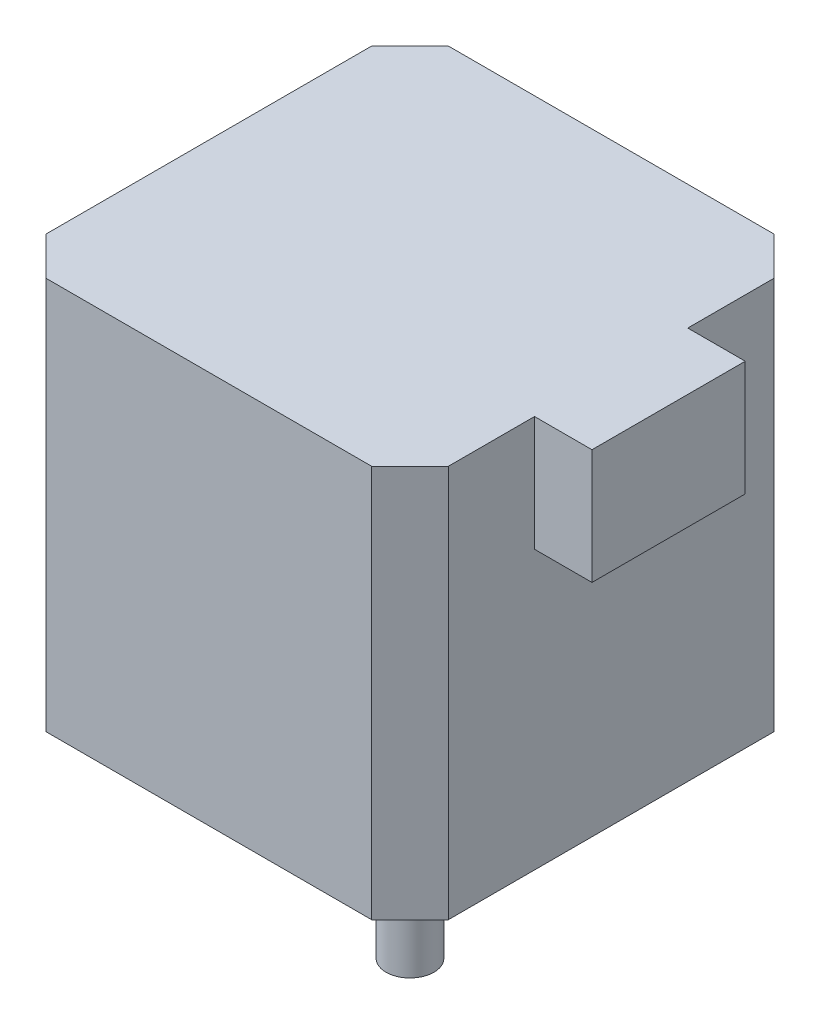
ISO-10303-21;
HEADER;
FILE_DESCRIPTION(('STEP AP214'),'2;1');
FILE_NAME('part.step','',(''),(''),'','','');
FILE_SCHEMA(('AUTOMOTIVE_DESIGN { 1 0 10303 214 1 1 1 1 }'));
ENDSEC;
DATA;
#1=APPLICATION_CONTEXT('core data for automotive mechanical design processes');
#2=APPLICATION_PROTOCOL_DEFINITION('international standard','automotive_design',2000,#1);
#3=PRODUCT_CONTEXT('',#1,'mechanical');
#4=PRODUCT('Part','Part','',(#3));
#5=PRODUCT_RELATED_PRODUCT_CATEGORY('part','',(#4));
#6=PRODUCT_DEFINITION_FORMATION('','',#4);
#7=PRODUCT_DEFINITION_CONTEXT('part definition',#1,'design');
#8=PRODUCT_DEFINITION('design','',#6,#7);
#9=PRODUCT_DEFINITION_SHAPE('','',#8);
#10=(LENGTH_UNIT() NAMED_UNIT(*) SI_UNIT(.MILLI.,.METRE.));
#11=(NAMED_UNIT(*) PLANE_ANGLE_UNIT() SI_UNIT($,.RADIAN.));
#12=(NAMED_UNIT(*) SI_UNIT($,.STERADIAN.) SOLID_ANGLE_UNIT());
#13=UNCERTAINTY_MEASURE_WITH_UNIT(LENGTH_MEASURE(1.E-05),#10,'distance_accuracy_value','');
#14=(GEOMETRIC_REPRESENTATION_CONTEXT(3) GLOBAL_UNCERTAINTY_ASSIGNED_CONTEXT((#13)) GLOBAL_UNIT_ASSIGNED_CONTEXT((#10,
#11,#12)) REPRESENTATION_CONTEXT('',''));
#15=CARTESIAN_POINT('',(0.,0.,0.));
#16=DIRECTION('',(0.,0.,1.));
#17=DIRECTION('',(1.,0.,0.));
#18=AXIS2_PLACEMENT_3D('',#15,#16,#17);
#19=CARTESIAN_POINT('',(21.,41.,-21.));
#20=DIRECTION('',(-1.,0.,0.));
#21=DIRECTION('',(0.,0.,1.));
#22=AXIS2_PLACEMENT_3D('',#19,#20,#21);
#23=PLANE('',#22);
#24=DIRECTION('',(0.,1.,0.));
#25=VECTOR('',#24,1.);
#26=CARTESIAN_POINT('',(21.,29.,-8.));
#27=LINE('',#26,#25);
#28=CARTESIAN_POINT('',(21.,29.,-8.));
#29=VERTEX_POINT('',#28);
#30=CARTESIAN_POINT('',(21.,41.,-8.00000000000001));
#31=VERTEX_POINT('',#30);
#32=EDGE_CURVE('E37',#29,#31,#27,.T.);
#33=ORIENTED_EDGE('',*,*,#32,.F.);
#34=DIRECTION('',(0.,0.,-1.));
#35=VECTOR('',#34,1.);
#36=CARTESIAN_POINT('',(21.,29.,8.));
#37=LINE('',#36,#35);
#38=CARTESIAN_POINT('',(21.,29.,8.));
#39=VERTEX_POINT('',#38);
#40=EDGE_CURVE('E169',#39,#29,#37,.T.);
#41=ORIENTED_EDGE('',*,*,#40,.F.);
#42=DIRECTION('',(0.,-1.,0.));
#43=VECTOR('',#42,1.);
#44=CARTESIAN_POINT('',(21.,29.,8.));
#45=LINE('',#44,#43);
#46=CARTESIAN_POINT('',(21.,41.,7.99999999999999));
#47=VERTEX_POINT('',#46);
#48=EDGE_CURVE('E178',#47,#39,#45,.T.);
#49=ORIENTED_EDGE('',*,*,#48,.F.);
#50=DIRECTION('',(0.,0.,-1.));
#51=VECTOR('',#50,1.);
#52=CARTESIAN_POINT('',(21.,41.,-21.));
#53=LINE('',#52,#51);
#54=CARTESIAN_POINT('',(21.,41.,17.));
#55=VERTEX_POINT('',#54);
#56=EDGE_CURVE('E205',#55,#47,#53,.T.);
#57=ORIENTED_EDGE('',*,*,#56,.F.);
#58=DIRECTION('',(0.,-1.,0.));
#59=VECTOR('',#58,1.);
#60=CARTESIAN_POINT('',(21.,41.,17.));
#61=LINE('',#60,#59);
#62=CARTESIAN_POINT('',(21.,0.,17.));
#63=VERTEX_POINT('',#62);
#64=EDGE_CURVE('E43',#55,#63,#61,.T.);
#65=ORIENTED_EDGE('',*,*,#64,.T.);
#66=DIRECTION('',(0.,0.,-1.));
#67=VECTOR('',#66,1.);
#68=CARTESIAN_POINT('',(21.,0.,-21.));
#69=LINE('',#68,#67);
#70=CARTESIAN_POINT('',(21.,0.,-17.));
#71=VERTEX_POINT('',#70);
#72=EDGE_CURVE('E193',#63,#71,#69,.T.);
#73=ORIENTED_EDGE('',*,*,#72,.T.);
#74=DIRECTION('',(0.,1.,0.));
#75=VECTOR('',#74,1.);
#76=CARTESIAN_POINT('',(21.,41.,-17.));
#77=LINE('',#76,#75);
#78=CARTESIAN_POINT('',(21.,41.,-17.));
#79=VERTEX_POINT('',#78);
#80=EDGE_CURVE('E11',#71,#79,#77,.T.);
#81=ORIENTED_EDGE('',*,*,#80,.T.);
#82=EDGE_CURVE('E54',#31,#79,#53,.T.);
#83=ORIENTED_EDGE('',*,*,#82,.F.);
#84=EDGE_LOOP('',(#33,#41,#49,#57,#65,#73,#81,#83));
#85=FACE_BOUND('',#84,.T.);
#86=ADVANCED_FACE('F33',(#85),#23,.F.);
#87=CARTESIAN_POINT('',(-21.,41.,-21.));
#88=DIRECTION('',(0.,0.,1.));
#89=DIRECTION('',(1.,0.,0.));
#90=AXIS2_PLACEMENT_3D('',#87,#88,#89);
#91=PLANE('',#90);
#92=DIRECTION('',(-1.,0.,0.));
#93=VECTOR('',#92,1.);
#94=CARTESIAN_POINT('',(-21.,0.,-21.));
#95=LINE('',#94,#93);
#96=CARTESIAN_POINT('',(17.,0.,-21.));
#97=VERTEX_POINT('',#96);
#98=CARTESIAN_POINT('',(-17.,0.,-21.));
#99=VERTEX_POINT('',#98);
#100=EDGE_CURVE('E250',#97,#99,#95,.T.);
#101=ORIENTED_EDGE('',*,*,#100,.T.);
#102=DIRECTION('',(0.,1.,0.));
#103=VECTOR('',#102,1.);
#104=CARTESIAN_POINT('',(-17.,41.,-21.));
#105=LINE('',#104,#103);
#106=CARTESIAN_POINT('',(-17.,41.,-21.));
#107=VERTEX_POINT('',#106);
#108=EDGE_CURVE('E212',#99,#107,#105,.T.);
#109=ORIENTED_EDGE('',*,*,#108,.T.);
#110=DIRECTION('',(-1.,0.,0.));
#111=VECTOR('',#110,1.);
#112=CARTESIAN_POINT('',(-21.,41.,-21.));
#113=LINE('',#112,#111);
#114=CARTESIAN_POINT('',(17.,41.,-21.));
#115=VERTEX_POINT('',#114);
#116=EDGE_CURVE('E199',#115,#107,#113,.T.);
#117=ORIENTED_EDGE('',*,*,#116,.F.);
#118=DIRECTION('',(0.,-1.,0.));
#119=VECTOR('',#118,1.);
#120=CARTESIAN_POINT('',(17.,41.,-21.));
#121=LINE('',#120,#119);
#122=EDGE_CURVE('E214',#115,#97,#121,.T.);
#123=ORIENTED_EDGE('',*,*,#122,.T.);
#124=EDGE_LOOP('',(#101,#109,#117,#123));
#125=FACE_BOUND('',#124,.T.);
#126=ADVANCED_FACE('F295',(#125),#91,.F.);
#127=CARTESIAN_POINT('',(-21.,41.,-21.));
#128=DIRECTION('',(1.,0.,0.));
#129=DIRECTION('',(0.,0.,-1.));
#130=AXIS2_PLACEMENT_3D('',#127,#128,#129);
#131=PLANE('',#130);
#132=DIRECTION('',(0.,0.,1.));
#133=VECTOR('',#132,1.);
#134=CARTESIAN_POINT('',(-21.,0.,-21.));
#135=LINE('',#134,#133);
#136=CARTESIAN_POINT('',(-21.,0.,-17.));
#137=VERTEX_POINT('',#136);
#138=CARTESIAN_POINT('',(-21.,0.,17.));
#139=VERTEX_POINT('',#138);
#140=EDGE_CURVE('E247',#137,#139,#135,.T.);
#141=ORIENTED_EDGE('',*,*,#140,.T.);
#142=DIRECTION('',(0.,1.,0.));
#143=VECTOR('',#142,1.);
#144=CARTESIAN_POINT('',(-21.,41.,17.));
#145=LINE('',#144,#143);
#146=CARTESIAN_POINT('',(-21.,41.,17.));
#147=VERTEX_POINT('',#146);
#148=EDGE_CURVE('E225',#139,#147,#145,.T.);
#149=ORIENTED_EDGE('',*,*,#148,.T.);
#150=DIRECTION('',(0.,0.,1.));
#151=VECTOR('',#150,1.);
#152=CARTESIAN_POINT('',(-21.,41.,-21.));
#153=LINE('',#152,#151);
#154=CARTESIAN_POINT('',(-21.,41.,-17.));
#155=VERTEX_POINT('',#154);
#156=EDGE_CURVE('E256',#155,#147,#153,.T.);
#157=ORIENTED_EDGE('',*,*,#156,.F.);
#158=DIRECTION('',(0.,-1.,0.));
#159=VECTOR('',#158,1.);
#160=CARTESIAN_POINT('',(-21.,41.,-17.));
#161=LINE('',#160,#159);
#162=EDGE_CURVE('E227',#155,#137,#161,.T.);
#163=ORIENTED_EDGE('',*,*,#162,.T.);
#164=EDGE_LOOP('',(#141,#149,#157,#163));
#165=FACE_BOUND('',#164,.T.);
#166=ADVANCED_FACE('F274',(#165),#131,.F.);
#167=CARTESIAN_POINT('',(-21.,41.,21.));
#168=DIRECTION('',(0.,0.,-1.));
#169=DIRECTION('',(-1.,0.,0.));
#170=AXIS2_PLACEMENT_3D('',#167,#168,#169);
#171=PLANE('',#170);
#172=DIRECTION('',(1.,0.,0.));
#173=VECTOR('',#172,1.);
#174=CARTESIAN_POINT('',(-21.,41.,21.));
#175=LINE('',#174,#173);
#176=CARTESIAN_POINT('',(-17.,41.,21.));
#177=VERTEX_POINT('',#176);
#178=CARTESIAN_POINT('',(17.,41.,21.));
#179=VERTEX_POINT('',#178);
#180=EDGE_CURVE('E243',#177,#179,#175,.T.);
#181=ORIENTED_EDGE('',*,*,#180,.F.);
#182=DIRECTION('',(0.,-1.,0.));
#183=VECTOR('',#182,1.);
#184=CARTESIAN_POINT('',(-17.,41.,21.));
#185=LINE('',#184,#183);
#186=CARTESIAN_POINT('',(-17.,0.,21.));
#187=VERTEX_POINT('',#186);
#188=EDGE_CURVE('E238',#177,#187,#185,.T.);
#189=ORIENTED_EDGE('',*,*,#188,.T.);
#190=DIRECTION('',(1.,0.,0.));
#191=VECTOR('',#190,1.);
#192=CARTESIAN_POINT('',(-21.,0.,21.));
#193=LINE('',#192,#191);
#194=CARTESIAN_POINT('',(17.,0.,21.));
#195=VERTEX_POINT('',#194);
#196=EDGE_CURVE('E244',#187,#195,#193,.T.);
#197=ORIENTED_EDGE('',*,*,#196,.T.);
#198=DIRECTION('',(0.,1.,0.));
#199=VECTOR('',#198,1.);
#200=CARTESIAN_POINT('',(17.,41.,21.));
#201=LINE('',#200,#199);
#202=EDGE_CURVE('E241',#195,#179,#201,.T.);
#203=ORIENTED_EDGE('',*,*,#202,.T.);
#204=EDGE_LOOP('',(#181,#189,#197,#203));
#205=FACE_BOUND('',#204,.T.);
#206=ADVANCED_FACE('F285',(#205),#171,.F.);
#207=CARTESIAN_POINT('',(0.,41.,0.));
#208=DIRECTION('',(0.,1.,0.));
#209=DIRECTION('',(0.,0.,1.));
#210=AXIS2_PLACEMENT_3D('',#207,#208,#209);
#211=PLANE('',#210);
#212=ORIENTED_EDGE('',*,*,#156,.T.);
#213=DIRECTION('',(-0.707106781186547,0.,-0.707106781186548));
#214=VECTOR('',#213,1.);
#215=CARTESIAN_POINT('',(-19.,41.,19.));
#216=LINE('',#215,#214);
#217=EDGE_CURVE('E217',#147,#177,#216,.F.);
#218=ORIENTED_EDGE('',*,*,#217,.T.);
#219=ORIENTED_EDGE('',*,*,#180,.T.);
#220=DIRECTION('',(-0.707106781186548,0.,0.707106781186547));
#221=VECTOR('',#220,1.);
#222=CARTESIAN_POINT('',(19.,41.,19.));
#223=LINE('',#222,#221);
#224=EDGE_CURVE('E223',#179,#55,#223,.F.);
#225=ORIENTED_EDGE('',*,*,#224,.T.);
#226=ORIENTED_EDGE('',*,*,#56,.T.);
#227=DIRECTION('',(-1.,0.,0.));
#228=VECTOR('',#227,1.);
#229=CARTESIAN_POINT('',(27.,41.,8.));
#230=LINE('',#229,#228);
#231=CARTESIAN_POINT('',(27.,41.,8.));
#232=VERTEX_POINT('',#231);
#233=EDGE_CURVE('E184',#232,#47,#230,.T.);
#234=ORIENTED_EDGE('',*,*,#233,.F.);
#235=DIRECTION('',(0.,0.,1.));
#236=VECTOR('',#235,1.);
#237=CARTESIAN_POINT('',(27.,41.,8.));
#238=LINE('',#237,#236);
#239=CARTESIAN_POINT('',(27.,41.,-8.));
#240=VERTEX_POINT('',#239);
#241=EDGE_CURVE('E168',#240,#232,#238,.T.);
#242=ORIENTED_EDGE('',*,*,#241,.F.);
#243=DIRECTION('',(-1.,0.,0.));
#244=VECTOR('',#243,1.);
#245=CARTESIAN_POINT('',(27.,41.,-8.));
#246=LINE('',#245,#244);
#247=EDGE_CURVE('E189',#240,#31,#246,.T.);
#248=ORIENTED_EDGE('',*,*,#247,.T.);
#249=ORIENTED_EDGE('',*,*,#82,.T.);
#250=DIRECTION('',(0.707106781186546,0.,0.707106781186549));
#251=VECTOR('',#250,1.);
#252=CARTESIAN_POINT('',(19.,41.,-19.));
#253=LINE('',#252,#251);
#254=EDGE_CURVE('E221',#79,#115,#253,.F.);
#255=ORIENTED_EDGE('',*,*,#254,.T.);
#256=ORIENTED_EDGE('',*,*,#116,.T.);
#257=DIRECTION('',(0.707106781186548,0.,-0.707106781186547));
#258=VECTOR('',#257,1.);
#259=CARTESIAN_POINT('',(-19.,41.,-19.));
#260=LINE('',#259,#258);
#261=EDGE_CURVE('E219',#107,#155,#260,.F.);
#262=ORIENTED_EDGE('',*,*,#261,.T.);
#263=EDGE_LOOP('',(#212,#218,#219,#225,#226,#234,#242,#248,#249,#255,#256,#262));
#264=FACE_BOUND('',#263,.T.);
#265=ADVANCED_FACE('F264',(#264),#211,.T.);
#266=CARTESIAN_POINT('',(0.,0.,0.));
#267=DIRECTION('',(0.,1.,0.));
#268=DIRECTION('',(0.,0.,1.));
#269=AXIS2_PLACEMENT_3D('',#266,#267,#268);
#270=PLANE('',#269);
#271=CARTESIAN_POINT('',(15.5,0.,15.5));
#272=DIRECTION('',(0.,-1.,0.));
#273=DIRECTION('',(0.,0.,-1.));
#274=AXIS2_PLACEMENT_3D('',#271,#272,#273);
#275=CIRCLE('',#274,1.24999999999999);
#276=CARTESIAN_POINT('',(15.5,0.,14.25));
#277=VERTEX_POINT('',#276);
#278=EDGE_CURVE('E143',#277,#277,#275,.T.);
#279=ORIENTED_EDGE('',*,*,#278,.F.);
#280=EDGE_LOOP('',(#279));
#281=FACE_BOUND('',#280,.T.);
#282=CARTESIAN_POINT('',(-15.5,0.,15.5));
#283=DIRECTION('',(0.,-1.,0.));
#284=DIRECTION('',(0.,0.,-1.));
#285=AXIS2_PLACEMENT_3D('',#282,#283,#284);
#286=CIRCLE('',#285,1.24999999999999);
#287=CARTESIAN_POINT('',(-15.5,0.,14.25));
#288=VERTEX_POINT('',#287);
#289=EDGE_CURVE('E142',#288,#288,#286,.T.);
#290=ORIENTED_EDGE('',*,*,#289,.F.);
#291=EDGE_LOOP('',(#290));
#292=FACE_BOUND('',#291,.T.);
#293=CARTESIAN_POINT('',(-15.5,0.,-15.5));
#294=DIRECTION('',(0.,-1.,0.));
#295=DIRECTION('',(0.,0.,-1.));
#296=AXIS2_PLACEMENT_3D('',#293,#294,#295);
#297=CIRCLE('',#296,1.24999999999999);
#298=CARTESIAN_POINT('',(-15.5,0.,-16.75));
#299=VERTEX_POINT('',#298);
#300=EDGE_CURVE('E153',#299,#299,#297,.T.);
#301=ORIENTED_EDGE('',*,*,#300,.F.);
#302=EDGE_LOOP('',(#301));
#303=FACE_BOUND('',#302,.T.);
#304=CARTESIAN_POINT('',(15.5,0.,-15.5));
#305=DIRECTION('',(0.,-1.,0.));
#306=DIRECTION('',(0.,0.,-1.));
#307=AXIS2_PLACEMENT_3D('',#304,#305,#306);
#308=CIRCLE('',#307,1.24999999999999);
#309=CARTESIAN_POINT('',(15.5,0.,-16.75));
#310=VERTEX_POINT('',#309);
#311=EDGE_CURVE('E159',#310,#310,#308,.T.);
#312=ORIENTED_EDGE('',*,*,#311,.F.);
#313=EDGE_LOOP('',(#312));
#314=FACE_BOUND('',#313,.T.);
#315=CARTESIAN_POINT('',(0.,0.,0.));
#316=DIRECTION('',(0.,1.,0.));
#317=DIRECTION('',(0.,0.,1.));
#318=AXIS2_PLACEMENT_3D('',#315,#316,#317);
#319=CIRCLE('',#318,11.);
#320=CARTESIAN_POINT('',(0.,0.,11.));
#321=VERTEX_POINT('',#320);
#322=EDGE_CURVE('E194',#321,#321,#319,.T.);
#323=ORIENTED_EDGE('',*,*,#322,.T.);
#324=EDGE_LOOP('',(#323));
#325=FACE_BOUND('',#324,.T.);
#326=ORIENTED_EDGE('',*,*,#196,.F.);
#327=DIRECTION('',(0.707106781186547,0.,0.707106781186548));
#328=VECTOR('',#327,1.);
#329=CARTESIAN_POINT('',(-17.,0.,21.));
#330=LINE('',#329,#328);
#331=EDGE_CURVE('E230',#187,#139,#330,.F.);
#332=ORIENTED_EDGE('',*,*,#331,.T.);
#333=ORIENTED_EDGE('',*,*,#140,.F.);
#334=DIRECTION('',(-0.707106781186548,0.,0.707106781186547));
#335=VECTOR('',#334,1.);
#336=CARTESIAN_POINT('',(-21.,0.,-17.));
#337=LINE('',#336,#335);
#338=EDGE_CURVE('E232',#137,#99,#337,.F.);
#339=ORIENTED_EDGE('',*,*,#338,.T.);
#340=ORIENTED_EDGE('',*,*,#100,.F.);
#341=DIRECTION('',(-0.707106781186546,0.,-0.707106781186549));
#342=VECTOR('',#341,1.);
#343=CARTESIAN_POINT('',(17.,0.,-21.));
#344=LINE('',#343,#342);
#345=EDGE_CURVE('E234',#97,#71,#344,.F.);
#346=ORIENTED_EDGE('',*,*,#345,.T.);
#347=ORIENTED_EDGE('',*,*,#72,.F.);
#348=DIRECTION('',(0.707106781186548,0.,-0.707106781186547));
#349=VECTOR('',#348,1.);
#350=CARTESIAN_POINT('',(21.,0.,17.));
#351=LINE('',#350,#349);
#352=EDGE_CURVE('E236',#63,#195,#351,.F.);
#353=ORIENTED_EDGE('',*,*,#352,.T.);
#354=EDGE_LOOP('',(#326,#332,#333,#339,#340,#346,#347,#353));
#355=FACE_BOUND('',#354,.T.);
#356=ADVANCED_FACE('F278',(#281,#292,#303,#314,#325,#355),#270,.F.);
#357=CARTESIAN_POINT('',(-17.,41.,21.));
#358=DIRECTION('',(0.707106781186548,0.,-0.707106781186547));
#359=DIRECTION('',(0.,-1.,0.));
#360=AXIS2_PLACEMENT_3D('',#357,#358,#359);
#361=PLANE('',#360);
#362=ORIENTED_EDGE('',*,*,#217,.F.);
#363=ORIENTED_EDGE('',*,*,#148,.F.);
#364=ORIENTED_EDGE('',*,*,#331,.F.);
#365=ORIENTED_EDGE('',*,*,#188,.F.);
#366=EDGE_LOOP('',(#362,#363,#364,#365));
#367=FACE_BOUND('',#366,.T.);
#368=ADVANCED_FACE('F282',(#367),#361,.F.);
#369=CARTESIAN_POINT('',(-21.,41.,-17.));
#370=DIRECTION('',(0.707106781186547,0.,0.707106781186548));
#371=DIRECTION('',(0.,-1.,0.));
#372=AXIS2_PLACEMENT_3D('',#369,#370,#371);
#373=PLANE('',#372);
#374=ORIENTED_EDGE('',*,*,#261,.F.);
#375=ORIENTED_EDGE('',*,*,#108,.F.);
#376=ORIENTED_EDGE('',*,*,#338,.F.);
#377=ORIENTED_EDGE('',*,*,#162,.F.);
#378=EDGE_LOOP('',(#374,#375,#376,#377));
#379=FACE_BOUND('',#378,.T.);
#380=ADVANCED_FACE('F271',(#379),#373,.F.);
#381=CARTESIAN_POINT('',(17.,41.,-21.));
#382=DIRECTION('',(-0.707106781186549,0.,0.707106781186546));
#383=DIRECTION('',(0.,-1.,0.));
#384=AXIS2_PLACEMENT_3D('',#381,#382,#383);
#385=PLANE('',#384);
#386=ORIENTED_EDGE('',*,*,#254,.F.);
#387=ORIENTED_EDGE('',*,*,#80,.F.);
#388=ORIENTED_EDGE('',*,*,#345,.F.);
#389=ORIENTED_EDGE('',*,*,#122,.F.);
#390=EDGE_LOOP('',(#386,#387,#388,#389));
#391=FACE_BOUND('',#390,.T.);
#392=ADVANCED_FACE('F294',(#391),#385,.F.);
#393=CARTESIAN_POINT('',(21.,41.,17.));
#394=DIRECTION('',(-0.707106781186547,0.,-0.707106781186548));
#395=DIRECTION('',(0.,-1.,0.));
#396=AXIS2_PLACEMENT_3D('',#393,#394,#395);
#397=PLANE('',#396);
#398=ORIENTED_EDGE('',*,*,#224,.F.);
#399=ORIENTED_EDGE('',*,*,#202,.F.);
#400=ORIENTED_EDGE('',*,*,#352,.F.);
#401=ORIENTED_EDGE('',*,*,#64,.F.);
#402=EDGE_LOOP('',(#398,#399,#400,#401));
#403=FACE_BOUND('',#402,.T.);
#404=ADVANCED_FACE('F35',(#403),#397,.F.);
#405=CARTESIAN_POINT('',(0.,-1.7,0.));
#406=DIRECTION('',(0.,1.,0.));
#407=DIRECTION('',(0.,0.,1.));
#408=AXIS2_PLACEMENT_3D('',#405,#406,#407);
#409=CYLINDRICAL_SURFACE('',#408,11.);
#410=CARTESIAN_POINT('',(0.,-1.7,0.));
#411=DIRECTION('',(0.,1.,0.));
#412=DIRECTION('',(0.,0.,1.));
#413=AXIS2_PLACEMENT_3D('',#410,#411,#412);
#414=CIRCLE('',#413,11.);
#415=CARTESIAN_POINT('',(0.,-1.7,11.));
#416=VERTEX_POINT('',#415);
#417=EDGE_CURVE('E190',#416,#416,#414,.T.);
#418=ORIENTED_EDGE('',*,*,#417,.T.);
#419=EDGE_LOOP('',(#418));
#420=FACE_BOUND('',#419,.T.);
#421=ORIENTED_EDGE('',*,*,#322,.F.);
#422=EDGE_LOOP('',(#421));
#423=FACE_BOUND('',#422,.T.);
#424=ADVANCED_FACE('F313',(#420,#423),#409,.T.);
#425=CARTESIAN_POINT('',(0.,-1.7,0.));
#426=DIRECTION('',(0.,1.,0.));
#427=DIRECTION('',(0.,0.,1.));
#428=AXIS2_PLACEMENT_3D('',#425,#426,#427);
#429=PLANE('',#428);
#430=CARTESIAN_POINT('',(0.,-1.7,0.));
#431=DIRECTION('',(0.,1.,0.));
#432=DIRECTION('',(0.,0.,1.));
#433=AXIS2_PLACEMENT_3D('',#430,#431,#432);
#434=CIRCLE('',#433,2.5);
#435=CARTESIAN_POINT('',(0.,-1.7,2.5));
#436=VERTEX_POINT('',#435);
#437=EDGE_CURVE('E188',#436,#436,#434,.T.);
#438=ORIENTED_EDGE('',*,*,#437,.T.);
#439=EDGE_LOOP('',(#438));
#440=FACE_BOUND('',#439,.T.);
#441=ORIENTED_EDGE('',*,*,#417,.F.);
#442=EDGE_LOOP('',(#441));
#443=FACE_BOUND('',#442,.T.);
#444=ADVANCED_FACE('F317',(#440,#443),#429,.F.);
#445=CARTESIAN_POINT('',(0.,-22.5,0.));
#446=DIRECTION('',(0.,1.,0.));
#447=DIRECTION('',(0.,0.,1.));
#448=AXIS2_PLACEMENT_3D('',#445,#446,#447);
#449=CYLINDRICAL_SURFACE('',#448,2.5);
#450=CARTESIAN_POINT('',(0.,-22.5,0.));
#451=DIRECTION('',(0.,1.,0.));
#452=DIRECTION('',(0.,0.,1.));
#453=AXIS2_PLACEMENT_3D('',#450,#451,#452);
#454=CIRCLE('',#453,2.5);
#455=CARTESIAN_POINT('',(0.,-22.5,2.5));
#456=VERTEX_POINT('',#455);
#457=EDGE_CURVE('E185',#456,#456,#454,.T.);
#458=CARTESIAN_POINT('',(0.,-22.5,2.5));
#459=CARTESIAN_POINT('',(0.,-22.2833333333333,2.5));
#460=CARTESIAN_POINT('',(0.,-22.0666666666667,2.5));
#461=CARTESIAN_POINT('',(0.,-21.6333333333333,2.5));
#462=CARTESIAN_POINT('',(0.,-21.4166666666667,2.5));
#463=CARTESIAN_POINT('',(0.,-20.9833333333333,2.5));
#464=CARTESIAN_POINT('',(0.,-20.7666666666667,2.5));
#465=CARTESIAN_POINT('',(0.,-20.3333333333333,2.5));
#466=CARTESIAN_POINT('',(0.,-20.1166666666667,2.5));
#467=CARTESIAN_POINT('',(0.,-19.6833333333333,2.5));
#468=CARTESIAN_POINT('',(0.,-19.4666666666667,2.5));
#469=CARTESIAN_POINT('',(0.,-19.0333333333333,2.5));
#470=CARTESIAN_POINT('',(0.,-18.8166666666667,2.5));
#471=CARTESIAN_POINT('',(0.,-18.3833333333333,2.5));
#472=CARTESIAN_POINT('',(0.,-18.1666666666667,2.5));
#473=CARTESIAN_POINT('',(0.,-17.7333333333333,2.5));
#474=CARTESIAN_POINT('',(0.,-17.5166666666667,2.5));
#475=CARTESIAN_POINT('',(0.,-17.0833333333333,2.5));
#476=CARTESIAN_POINT('',(0.,-16.8666666666667,2.5));
#477=CARTESIAN_POINT('',(0.,-16.4333333333333,2.5));
#478=CARTESIAN_POINT('',(0.,-16.2166666666667,2.5));
#479=CARTESIAN_POINT('',(0.,-15.7833333333333,2.5));
#480=CARTESIAN_POINT('',(0.,-15.5666666666667,2.5));
#481=CARTESIAN_POINT('',(0.,-15.1333333333333,2.5));
#482=CARTESIAN_POINT('',(0.,-14.9166666666667,2.5));
#483=CARTESIAN_POINT('',(0.,-14.4833333333333,2.5));
#484=CARTESIAN_POINT('',(0.,-14.2666666666667,2.5));
#485=CARTESIAN_POINT('',(0.,-13.8333333333333,2.5));
#486=CARTESIAN_POINT('',(0.,-13.6166666666667,2.5));
#487=CARTESIAN_POINT('',(0.,-13.1833333333333,2.5));
#488=CARTESIAN_POINT('',(0.,-12.9666666666667,2.5));
#489=CARTESIAN_POINT('',(0.,-12.5333333333333,2.5));
#490=CARTESIAN_POINT('',(0.,-12.3166666666667,2.5));
#491=CARTESIAN_POINT('',(0.,-11.8833333333333,2.5));
#492=CARTESIAN_POINT('',(0.,-11.6666666666667,2.5));
#493=CARTESIAN_POINT('',(0.,-11.2333333333333,2.5));
#494=CARTESIAN_POINT('',(0.,-11.0166666666667,2.5));
#495=CARTESIAN_POINT('',(0.,-10.5833333333333,2.5));
#496=CARTESIAN_POINT('',(0.,-10.3666666666667,2.5));
#497=CARTESIAN_POINT('',(0.,-9.93333333333334,2.5));
#498=CARTESIAN_POINT('',(0.,-9.71666666666667,2.5));
#499=CARTESIAN_POINT('',(0.,-9.28333333333334,2.5));
#500=CARTESIAN_POINT('',(0.,-9.06666666666667,2.5));
#501=CARTESIAN_POINT('',(0.,-8.63333333333334,2.5));
#502=CARTESIAN_POINT('',(0.,-8.41666666666667,2.5));
#503=CARTESIAN_POINT('',(0.,-7.98333333333334,2.5));
#504=CARTESIAN_POINT('',(0.,-7.76666666666667,2.5));
#505=CARTESIAN_POINT('',(0.,-7.33333333333334,2.5));
#506=CARTESIAN_POINT('',(0.,-7.11666666666667,2.5));
#507=CARTESIAN_POINT('',(0.,-6.68333333333334,2.5));
#508=CARTESIAN_POINT('',(0.,-6.46666666666667,2.5));
#509=CARTESIAN_POINT('',(0.,-6.03333333333334,2.5));
#510=CARTESIAN_POINT('',(0.,-5.81666666666667,2.5));
#511=CARTESIAN_POINT('',(0.,-5.38333333333334,2.5));
#512=CARTESIAN_POINT('',(0.,-5.16666666666667,2.5));
#513=CARTESIAN_POINT('',(0.,-4.73333333333334,2.5));
#514=CARTESIAN_POINT('',(0.,-4.51666666666667,2.5));
#515=CARTESIAN_POINT('',(0.,-4.08333333333334,2.5));
#516=CARTESIAN_POINT('',(0.,-3.86666666666667,2.5));
#517=CARTESIAN_POINT('',(0.,-3.43333333333334,2.5));
#518=CARTESIAN_POINT('',(0.,-3.21666666666667,2.5));
#519=CARTESIAN_POINT('',(0.,-2.78333333333334,2.5));
#520=CARTESIAN_POINT('',(0.,-2.56666666666667,2.5));
#521=CARTESIAN_POINT('',(0.,-2.13333333333334,2.5));
#522=CARTESIAN_POINT('',(0.,-1.91666666666667,2.5));
#523=CARTESIAN_POINT('',(0.,-1.7,2.5));
#524=B_SPLINE_CURVE_WITH_KNOTS('',3,(#458,#459,#460,#461,#462,#463,#464,#465,#466,#467,#468,
#469,#470,#471,#472,#473,#474,#475,#476,#477,#478,#479,#480,#481,#482,#483,#484,#485,#486,#487,
#488,#489,#490,#491,#492,#493,#494,#495,#496,#497,#498,#499,#500,#501,#502,#503,#504,#505,#506,
#507,#508,#509,#510,#511,#512,#513,#514,#515,#516,#517,#518,#519,#520,#521,#522,#523),
.UNSPECIFIED.,.F.,.F.,(4,2,2,2,2,2,2,2,2,2,2,2,2,2,2,2,2,2,2,2,2,2,2,2,2,2,2,2,2,2,2,2,4),(0.,
0.649999999999998,1.3,1.95,2.6,3.25,3.9,4.55,5.2,5.85,6.5,7.15,7.8,8.45,9.1,9.75,10.4,11.05,
11.7,12.35,13.,13.65,14.3,14.95,15.6,16.25,16.9,17.55,18.2,18.85,19.5,20.15,20.8),.UNSPECIFIED.);
#525=EDGE_CURVE('BSEAM323',#456,#436,#524,.T.);
#526=ORIENTED_EDGE('',*,*,#457,.T.);
#527=ORIENTED_EDGE('',*,*,#437,.F.);
#528=ORIENTED_EDGE('',*,*,#525,.T.);
#529=ORIENTED_EDGE('',*,*,#525,.F.);
#530=EDGE_LOOP('',(#526,#528,#527,#529));
#531=FACE_BOUND('',#530,.T.);
#532=ADVANCED_FACE('F323',(#531),#449,.T.);
#533=CARTESIAN_POINT('',(0.,-22.5,0.));
#534=DIRECTION('',(0.,1.,0.));
#535=DIRECTION('',(0.,0.,1.));
#536=AXIS2_PLACEMENT_3D('',#533,#534,#535);
#537=PLANE('',#536);
#538=ORIENTED_EDGE('',*,*,#457,.F.);
#539=EDGE_LOOP('',(#538));
#540=FACE_BOUND('',#539,.T.);
#541=ADVANCED_FACE('F388',(#540),#537,.F.);
#542=CARTESIAN_POINT('',(27.,29.,-8.));
#543=DIRECTION('',(0.,0.,1.));
#544=DIRECTION('',(1.,0.,0.));
#545=AXIS2_PLACEMENT_3D('',#542,#543,#544);
#546=PLANE('',#545);
#547=ORIENTED_EDGE('',*,*,#32,.T.);
#548=ORIENTED_EDGE('',*,*,#247,.F.);
#549=DIRECTION('',(0.,1.,0.));
#550=VECTOR('',#549,1.);
#551=CARTESIAN_POINT('',(27.,29.,-8.));
#552=LINE('',#551,#550);
#553=CARTESIAN_POINT('',(27.,29.,-8.));
#554=VERTEX_POINT('',#553);
#555=EDGE_CURVE('E165',#554,#240,#552,.T.);
#556=ORIENTED_EDGE('',*,*,#555,.F.);
#557=DIRECTION('',(-1.,0.,0.));
#558=VECTOR('',#557,1.);
#559=CARTESIAN_POINT('',(27.,29.,-8.));
#560=LINE('',#559,#558);
#561=EDGE_CURVE('E174',#554,#29,#560,.T.);
#562=ORIENTED_EDGE('',*,*,#561,.T.);
#563=EDGE_LOOP('',(#547,#548,#556,#562));
#564=FACE_BOUND('',#563,.T.);
#565=ADVANCED_FACE('F396',(#564),#546,.F.);
#566=CARTESIAN_POINT('',(27.,29.,8.));
#567=DIRECTION('',(0.,0.,-1.));
#568=DIRECTION('',(-1.,0.,0.));
#569=AXIS2_PLACEMENT_3D('',#566,#567,#568);
#570=PLANE('',#569);
#571=ORIENTED_EDGE('',*,*,#48,.T.);
#572=DIRECTION('',(-1.,0.,0.));
#573=VECTOR('',#572,1.);
#574=CARTESIAN_POINT('',(27.,29.,8.));
#575=LINE('',#574,#573);
#576=CARTESIAN_POINT('',(27.,29.,8.));
#577=VERTEX_POINT('',#576);
#578=EDGE_CURVE('E181',#577,#39,#575,.T.);
#579=ORIENTED_EDGE('',*,*,#578,.F.);
#580=DIRECTION('',(0.,-1.,0.));
#581=VECTOR('',#580,1.);
#582=CARTESIAN_POINT('',(27.,29.,8.));
#583=LINE('',#582,#581);
#584=EDGE_CURVE('E171',#232,#577,#583,.T.);
#585=ORIENTED_EDGE('',*,*,#584,.F.);
#586=ORIENTED_EDGE('',*,*,#233,.T.);
#587=EDGE_LOOP('',(#571,#579,#585,#586));
#588=FACE_BOUND('',#587,.T.);
#589=ADVANCED_FACE('F416',(#588),#570,.F.);
#590=CARTESIAN_POINT('',(27.,29.,8.));
#591=DIRECTION('',(0.,1.,0.));
#592=DIRECTION('',(0.,0.,1.));
#593=AXIS2_PLACEMENT_3D('',#590,#591,#592);
#594=PLANE('',#593);
#595=ORIENTED_EDGE('',*,*,#40,.T.);
#596=ORIENTED_EDGE('',*,*,#561,.F.);
#597=DIRECTION('',(0.,0.,-1.));
#598=VECTOR('',#597,1.);
#599=CARTESIAN_POINT('',(27.,29.,8.));
#600=LINE('',#599,#598);
#601=EDGE_CURVE('E173',#577,#554,#600,.T.);
#602=ORIENTED_EDGE('',*,*,#601,.F.);
#603=ORIENTED_EDGE('',*,*,#578,.T.);
#604=EDGE_LOOP('',(#595,#596,#602,#603));
#605=FACE_BOUND('',#604,.T.);
#606=ADVANCED_FACE('F425',(#605),#594,.F.);
#607=CARTESIAN_POINT('',(27.,0.,0.));
#608=DIRECTION('',(-1.,0.,0.));
#609=DIRECTION('',(0.,0.,1.));
#610=AXIS2_PLACEMENT_3D('',#607,#608,#609);
#611=PLANE('',#610);
#612=ORIENTED_EDGE('',*,*,#555,.T.);
#613=ORIENTED_EDGE('',*,*,#241,.T.);
#614=ORIENTED_EDGE('',*,*,#584,.T.);
#615=ORIENTED_EDGE('',*,*,#601,.T.);
#616=EDGE_LOOP('',(#612,#613,#614,#615));
#617=FACE_BOUND('',#616,.T.);
#618=ADVANCED_FACE('F434',(#617),#611,.F.);
#619=CARTESIAN_POINT('',(15.5,8.00000000000001,-15.5));
#620=DIRECTION('',(0.,-1.,0.));
#621=DIRECTION('',(0.,0.,-1.));
#622=AXIS2_PLACEMENT_3D('',#619,#620,#621);
#623=CONICAL_SURFACE('',#622,1.24999999999999,1.02974425867665);
#624=CARTESIAN_POINT('',(15.5,8.75107577378445,-15.5));
#625=VERTEX_POINT('',#624);
#626=VERTEX_LOOP('',#625);
#627=FACE_BOUND('',#626,.T.);
#628=CARTESIAN_POINT('',(15.5,8.00000000000001,-15.5));
#629=DIRECTION('',(0.,-1.,0.));
#630=DIRECTION('',(0.,0.,-1.));
#631=AXIS2_PLACEMENT_3D('',#628,#629,#630);
#632=CIRCLE('',#631,1.24999999999999);
#633=CARTESIAN_POINT('',(15.5,8.00000000000001,-16.75));
#634=VERTEX_POINT('',#633);
#635=EDGE_CURVE('E162',#634,#634,#632,.T.);
#636=ORIENTED_EDGE('',*,*,#635,.T.);
#637=EDGE_LOOP('',(#636));
#638=FACE_BOUND('',#637,.T.);
#639=ADVANCED_FACE('F442',(#627,#638),#623,.F.);
#640=CARTESIAN_POINT('',(15.5,0.,-15.5));
#641=DIRECTION('',(0.,-1.,0.));
#642=DIRECTION('',(0.,0.,-1.));
#643=AXIS2_PLACEMENT_3D('',#640,#641,#642);
#644=CYLINDRICAL_SURFACE('',#643,1.24999999999999);
#645=ORIENTED_EDGE('',*,*,#635,.F.);
#646=EDGE_LOOP('',(#645));
#647=FACE_BOUND('',#646,.T.);
#648=ORIENTED_EDGE('',*,*,#311,.T.);
#649=EDGE_LOOP('',(#648));
#650=FACE_BOUND('',#649,.T.);
#651=ADVANCED_FACE('F450',(#647,#650),#644,.F.);
#652=CARTESIAN_POINT('',(-15.5,8.00000000000001,-15.5));
#653=DIRECTION('',(0.,-1.,0.));
#654=DIRECTION('',(0.,0.,-1.));
#655=AXIS2_PLACEMENT_3D('',#652,#653,#654);
#656=CONICAL_SURFACE('',#655,1.24999999999999,1.02974425867665);
#657=CARTESIAN_POINT('',(-15.5,8.75107577378445,-15.5));
#658=VERTEX_POINT('',#657);
#659=VERTEX_LOOP('',#658);
#660=FACE_BOUND('',#659,.T.);
#661=CARTESIAN_POINT('',(-15.5,8.00000000000001,-15.5));
#662=DIRECTION('',(0.,-1.,0.));
#663=DIRECTION('',(0.,0.,-1.));
#664=AXIS2_PLACEMENT_3D('',#661,#662,#663);
#665=CIRCLE('',#664,1.24999999999999);
#666=CARTESIAN_POINT('',(-15.5,8.00000000000001,-16.75));
#667=VERTEX_POINT('',#666);
#668=EDGE_CURVE('E156',#667,#667,#665,.T.);
#669=ORIENTED_EDGE('',*,*,#668,.T.);
#670=EDGE_LOOP('',(#669));
#671=FACE_BOUND('',#670,.T.);
#672=ADVANCED_FACE('F459',(#660,#671),#656,.F.);
#673=CARTESIAN_POINT('',(-15.5,0.,-15.5));
#674=DIRECTION('',(0.,-1.,0.));
#675=DIRECTION('',(0.,0.,-1.));
#676=AXIS2_PLACEMENT_3D('',#673,#674,#675);
#677=CYLINDRICAL_SURFACE('',#676,1.24999999999999);
#678=ORIENTED_EDGE('',*,*,#668,.F.);
#679=EDGE_LOOP('',(#678));
#680=FACE_BOUND('',#679,.T.);
#681=ORIENTED_EDGE('',*,*,#300,.T.);
#682=EDGE_LOOP('',(#681));
#683=FACE_BOUND('',#682,.T.);
#684=ADVANCED_FACE('F468',(#680,#683),#677,.F.);
#685=CARTESIAN_POINT('',(-15.5,8.00000000000001,15.5));
#686=DIRECTION('',(0.,-1.,0.));
#687=DIRECTION('',(0.,0.,-1.));
#688=AXIS2_PLACEMENT_3D('',#685,#686,#687);
#689=CONICAL_SURFACE('',#688,1.24999999999999,1.02974425867665);
#690=CARTESIAN_POINT('',(-15.5,8.75107577378445,15.5));
#691=VERTEX_POINT('',#690);
#692=VERTEX_LOOP('',#691);
#693=FACE_BOUND('',#692,.T.);
#694=CARTESIAN_POINT('',(-15.5,8.00000000000001,15.5));
#695=DIRECTION('',(0.,-1.,0.));
#696=DIRECTION('',(0.,0.,-1.));
#697=AXIS2_PLACEMENT_3D('',#694,#695,#696);
#698=CIRCLE('',#697,1.24999999999999);
#699=CARTESIAN_POINT('',(-15.5,8.00000000000001,14.25));
#700=VERTEX_POINT('',#699);
#701=EDGE_CURVE('E146',#700,#700,#698,.T.);
#702=ORIENTED_EDGE('',*,*,#701,.T.);
#703=EDGE_LOOP('',(#702));
#704=FACE_BOUND('',#703,.T.);
#705=ADVANCED_FACE('F477',(#693,#704),#689,.F.);
#706=CARTESIAN_POINT('',(-15.5,0.,15.5));
#707=DIRECTION('',(0.,-1.,0.));
#708=DIRECTION('',(0.,0.,-1.));
#709=AXIS2_PLACEMENT_3D('',#706,#707,#708);
#710=CYLINDRICAL_SURFACE('',#709,1.24999999999999);
#711=ORIENTED_EDGE('',*,*,#701,.F.);
#712=EDGE_LOOP('',(#711));
#713=FACE_BOUND('',#712,.T.);
#714=ORIENTED_EDGE('',*,*,#289,.T.);
#715=EDGE_LOOP('',(#714));
#716=FACE_BOUND('',#715,.T.);
#717=ADVANCED_FACE('F136',(#713,#716),#710,.F.);
#718=CARTESIAN_POINT('',(15.5,8.00000000000001,15.5));
#719=DIRECTION('',(0.,-1.,0.));
#720=DIRECTION('',(0.,0.,-1.));
#721=AXIS2_PLACEMENT_3D('',#718,#719,#720);
#722=CONICAL_SURFACE('',#721,1.24999999999999,1.02974425867665);
#723=CARTESIAN_POINT('',(15.5,8.75107577378445,15.5));
#724=VERTEX_POINT('',#723);
#725=VERTEX_LOOP('',#724);
#726=FACE_BOUND('',#725,.T.);
#727=CARTESIAN_POINT('',(15.5,8.00000000000001,15.5));
#728=DIRECTION('',(0.,-1.,0.));
#729=DIRECTION('',(0.,0.,-1.));
#730=AXIS2_PLACEMENT_3D('',#727,#728,#729);
#731=CIRCLE('',#730,1.24999999999999);
#732=CARTESIAN_POINT('',(15.5,8.00000000000001,14.25));
#733=VERTEX_POINT('',#732);
#734=EDGE_CURVE('E140',#733,#733,#731,.T.);
#735=ORIENTED_EDGE('',*,*,#734,.T.);
#736=EDGE_LOOP('',(#735));
#737=FACE_BOUND('',#736,.T.);
#738=ADVANCED_FACE('F132',(#726,#737),#722,.F.);
#739=CARTESIAN_POINT('',(15.5,0.,15.5));
#740=DIRECTION('',(0.,-1.,0.));
#741=DIRECTION('',(0.,0.,-1.));
#742=AXIS2_PLACEMENT_3D('',#739,#740,#741);
#743=CYLINDRICAL_SURFACE('',#742,1.24999999999999);
#744=ORIENTED_EDGE('',*,*,#734,.F.);
#745=EDGE_LOOP('',(#744));
#746=FACE_BOUND('',#745,.T.);
#747=ORIENTED_EDGE('',*,*,#278,.T.);
#748=EDGE_LOOP('',(#747));
#749=FACE_BOUND('',#748,.T.);
#750=ADVANCED_FACE('F135',(#746,#749),#743,.F.);
#751=CLOSED_SHELL('',(#86,#126,#166,#206,#265,#356,#368,#380,#392,#404,#424,#444,#532,#541,#565,
#589,#606,#618,#639,#651,#672,#684,#705,#717,#738,#750));
#752=MANIFOLD_SOLID_BREP('B2',#751);
#753=ADVANCED_BREP_SHAPE_REPRESENTATION('',(#18,#752),#14);
#754=SHAPE_DEFINITION_REPRESENTATION(#9,#753);
ENDSEC;
END-ISO-10303-21;
